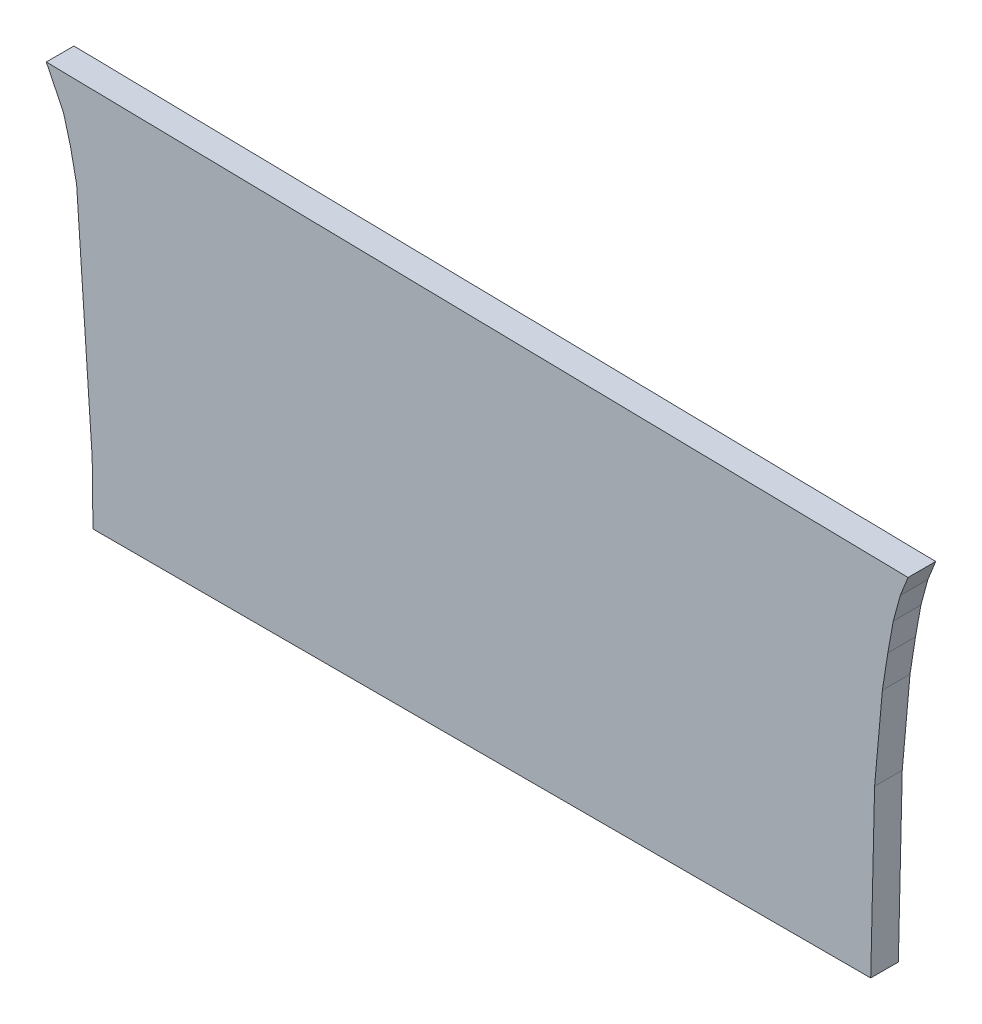
ISO-10303-21;
HEADER;
FILE_DESCRIPTION(('STEP AP214'),'2;1');
FILE_NAME('part.step','',(''),(''),'','','');
FILE_SCHEMA(('AUTOMOTIVE_DESIGN { 1 0 10303 214 1 1 1 1 }'));
ENDSEC;
DATA;
#1=APPLICATION_CONTEXT('core data for automotive mechanical design processes');
#2=APPLICATION_PROTOCOL_DEFINITION('international standard','automotive_design',2000,#1);
#3=PRODUCT_CONTEXT('',#1,'mechanical');
#4=PRODUCT('Part','Part','',(#3));
#5=PRODUCT_RELATED_PRODUCT_CATEGORY('part','',(#4));
#6=PRODUCT_DEFINITION_FORMATION('','',#4);
#7=PRODUCT_DEFINITION_CONTEXT('part definition',#1,'design');
#8=PRODUCT_DEFINITION('design','',#6,#7);
#9=PRODUCT_DEFINITION_SHAPE('','',#8);
#10=(LENGTH_UNIT() NAMED_UNIT(*) SI_UNIT(.MILLI.,.METRE.));
#11=(NAMED_UNIT(*) PLANE_ANGLE_UNIT() SI_UNIT($,.RADIAN.));
#12=(NAMED_UNIT(*) SI_UNIT($,.STERADIAN.) SOLID_ANGLE_UNIT());
#13=UNCERTAINTY_MEASURE_WITH_UNIT(LENGTH_MEASURE(1.E-05),#10,'distance_accuracy_value','');
#14=(GEOMETRIC_REPRESENTATION_CONTEXT(3) GLOBAL_UNCERTAINTY_ASSIGNED_CONTEXT((#13)) GLOBAL_UNIT_ASSIGNED_CONTEXT((#10,
#11,#12)) REPRESENTATION_CONTEXT('',''));
#15=CARTESIAN_POINT('',(0.,0.,0.));
#16=DIRECTION('',(0.,0.,1.));
#17=DIRECTION('',(1.,0.,0.));
#18=AXIS2_PLACEMENT_3D('',#15,#16,#17);
#19=CARTESIAN_POINT('',(57.939998626709,77.5899963378906,0.));
#20=DIRECTION('',(-0.999732083329301,0.0231465237575006,0.));
#21=DIRECTION('',(0.0231465237575006,0.999732083329301,0.));
#22=AXIS2_PLACEMENT_3D('',#19,#20,#21);
#23=PLANE('',#22);
#24=DIRECTION('',(0.0231465237575006,0.999732083329301,0.));
#25=VECTOR('',#24,1.);
#26=CARTESIAN_POINT('',(57.939998626709,77.5899963378906,0.03556));
#27=LINE('',#26,#25);
#28=CARTESIAN_POINT('',(57.939998626709,77.5899963378906,0.03556));
#29=VERTEX_POINT('',#28);
#30=CARTESIAN_POINT('',(57.9449996948242,77.8059997558594,0.03556));
#31=VERTEX_POINT('',#30);
#32=EDGE_CURVE('E11',#29,#31,#27,.T.);
#33=ORIENTED_EDGE('',*,*,#32,.F.);
#34=DIRECTION('',(0.,0.,1.));
#35=VECTOR('',#34,1.);
#36=CARTESIAN_POINT('',(57.939998626709,77.5899963378906,0.));
#37=LINE('',#36,#35);
#38=CARTESIAN_POINT('',(57.939998626709,77.5899963378906,0.));
#39=VERTEX_POINT('',#38);
#40=EDGE_CURVE('E24',#39,#29,#37,.T.);
#41=ORIENTED_EDGE('',*,*,#40,.F.);
#42=DIRECTION('',(0.0231465237575006,0.999732083329301,0.));
#43=VECTOR('',#42,1.);
#44=CARTESIAN_POINT('',(57.939998626709,77.5899963378906,0.));
#45=LINE('',#44,#43);
#46=CARTESIAN_POINT('',(57.9449996948242,77.8059997558594,0.));
#47=VERTEX_POINT('',#46);
#48=EDGE_CURVE('E130',#39,#47,#45,.T.);
#49=ORIENTED_EDGE('',*,*,#48,.T.);
#50=DIRECTION('',(0.,0.,1.));
#51=VECTOR('',#50,1.);
#52=CARTESIAN_POINT('',(57.9449996948242,77.8059997558594,0.));
#53=LINE('',#52,#51);
#54=EDGE_CURVE('E37',#47,#31,#53,.T.);
#55=ORIENTED_EDGE('',*,*,#54,.T.);
#56=EDGE_LOOP('',(#33,#41,#49,#55));
#57=FACE_BOUND('',#56,.T.);
#58=ADVANCED_FACE('F17',(#57),#23,.F.);
#59=CARTESIAN_POINT('',(57.9449996948242,77.8059997558594,0.));
#60=DIRECTION('',(-0.996035987954145,0.0889511703138886,0.));
#61=DIRECTION('',(0.0889511703138886,0.996035987954145,0.));
#62=AXIS2_PLACEMENT_3D('',#59,#60,#61);
#63=PLANE('',#62);
#64=DIRECTION('',(0.0889511703138886,0.996035987954145,0.));
#65=VECTOR('',#64,1.);
#66=CARTESIAN_POINT('',(57.9449996948242,77.8059997558594,0.03556));
#67=LINE('',#66,#65);
#68=CARTESIAN_POINT('',(57.9550018310547,77.9179992675781,0.03556));
#69=VERTEX_POINT('',#68);
#70=EDGE_CURVE('E210',#31,#69,#67,.T.);
#71=ORIENTED_EDGE('',*,*,#70,.F.);
#72=ORIENTED_EDGE('',*,*,#54,.F.);
#73=DIRECTION('',(0.0889511703138886,0.996035987954145,0.));
#74=VECTOR('',#73,1.);
#75=CARTESIAN_POINT('',(57.9449996948242,77.8059997558594,0.));
#76=LINE('',#75,#74);
#77=CARTESIAN_POINT('',(57.9550018310547,77.9179992675781,0.));
#78=VERTEX_POINT('',#77);
#79=EDGE_CURVE('E207',#47,#78,#76,.T.);
#80=ORIENTED_EDGE('',*,*,#79,.T.);
#81=DIRECTION('',(0.,0.,1.));
#82=VECTOR('',#81,1.);
#83=CARTESIAN_POINT('',(57.9550018310547,77.9179992675781,0.));
#84=LINE('',#83,#82);
#85=EDGE_CURVE('E205',#78,#69,#84,.T.);
#86=ORIENTED_EDGE('',*,*,#85,.T.);
#87=EDGE_LOOP('',(#71,#72,#80,#86));
#88=FACE_BOUND('',#87,.T.);
#89=ADVANCED_FACE('F218',(#88),#63,.F.);
#90=CARTESIAN_POINT('',(57.9550018310547,77.9179992675781,0.));
#91=DIRECTION('',(-0.988115620768596,0.15371245880895,0.));
#92=DIRECTION('',(0.15371245880895,0.988115620768596,0.));
#93=AXIS2_PLACEMENT_3D('',#90,#91,#92);
#94=PLANE('',#93);
#95=DIRECTION('',(0.15371245880895,0.988115620768595,0.));
#96=VECTOR('',#95,1.);
#97=CARTESIAN_POINT('',(57.9550018310547,77.9179992675781,0.03556));
#98=LINE('',#97,#96);
#99=CARTESIAN_POINT('',(57.9620018005371,77.9629974365234,0.03556));
#100=VERTEX_POINT('',#99);
#101=EDGE_CURVE('E202',#69,#100,#98,.T.);
#102=ORIENTED_EDGE('',*,*,#101,.F.);
#103=ORIENTED_EDGE('',*,*,#85,.F.);
#104=DIRECTION('',(0.15371245880895,0.988115620768595,0.));
#105=VECTOR('',#104,1.);
#106=CARTESIAN_POINT('',(57.9550018310547,77.9179992675781,0.));
#107=LINE('',#106,#105);
#108=CARTESIAN_POINT('',(57.9620018005371,77.9629974365234,0.));
#109=VERTEX_POINT('',#108);
#110=EDGE_CURVE('E199',#78,#109,#107,.T.);
#111=ORIENTED_EDGE('',*,*,#110,.T.);
#112=DIRECTION('',(0.,0.,1.));
#113=VECTOR('',#112,1.);
#114=CARTESIAN_POINT('',(57.9620018005371,77.9629974365234,0.));
#115=LINE('',#114,#113);
#116=EDGE_CURVE('E197',#109,#100,#115,.T.);
#117=ORIENTED_EDGE('',*,*,#116,.T.);
#118=EDGE_LOOP('',(#102,#103,#111,#117));
#119=FACE_BOUND('',#118,.T.);
#120=ADVANCED_FACE('F224',(#119),#94,.F.);
#121=CARTESIAN_POINT('',(57.9620018005371,77.9629974365234,0.));
#122=DIRECTION('',(-0.984272494666121,0.176656888469516,0.));
#123=DIRECTION('',(0.176656888469516,0.984272494666121,0.));
#124=AXIS2_PLACEMENT_3D('',#121,#122,#123);
#125=PLANE('',#124);
#126=DIRECTION('',(0.176656888469516,0.984272494666121,0.));
#127=VECTOR('',#126,1.);
#128=CARTESIAN_POINT('',(57.9620018005371,77.9629974365234,0.03556));
#129=LINE('',#128,#127);
#130=CARTESIAN_POINT('',(57.9690017700195,78.0019989013672,0.03556));
#131=VERTEX_POINT('',#130);
#132=EDGE_CURVE('E194',#100,#131,#129,.T.);
#133=ORIENTED_EDGE('',*,*,#132,.F.);
#134=ORIENTED_EDGE('',*,*,#116,.F.);
#135=DIRECTION('',(0.176656888469516,0.984272494666121,0.));
#136=VECTOR('',#135,1.);
#137=CARTESIAN_POINT('',(57.9620018005371,77.9629974365234,0.));
#138=LINE('',#137,#136);
#139=CARTESIAN_POINT('',(57.9690017700195,78.0019989013672,0.));
#140=VERTEX_POINT('',#139);
#141=EDGE_CURVE('E191',#109,#140,#138,.T.);
#142=ORIENTED_EDGE('',*,*,#141,.T.);
#143=DIRECTION('',(0.,0.,1.));
#144=VECTOR('',#143,1.);
#145=CARTESIAN_POINT('',(57.9690017700195,78.0019989013672,0.));
#146=LINE('',#145,#144);
#147=EDGE_CURVE('E189',#140,#131,#146,.T.);
#148=ORIENTED_EDGE('',*,*,#147,.T.);
#149=EDGE_LOOP('',(#133,#134,#142,#148));
#150=FACE_BOUND('',#149,.T.);
#151=ADVANCED_FACE('F226',(#150),#125,.F.);
#152=CARTESIAN_POINT('',(57.9690017700195,78.0019989013672,0.));
#153=DIRECTION('',(-0.964781832080558,0.26305135712876,0.));
#154=DIRECTION('',(0.26305135712876,0.964781832080558,0.));
#155=AXIS2_PLACEMENT_3D('',#152,#153,#154);
#156=PLANE('',#155);
#157=DIRECTION('',(0.26305135712876,0.964781832080558,0.));
#158=VECTOR('',#157,1.);
#159=CARTESIAN_POINT('',(57.9690017700195,78.0019989013672,0.03556));
#160=LINE('',#159,#158);
#161=CARTESIAN_POINT('',(57.9780006408691,78.0350036621094,0.03556));
#162=VERTEX_POINT('',#161);
#163=EDGE_CURVE('E186',#131,#162,#160,.T.);
#164=ORIENTED_EDGE('',*,*,#163,.F.);
#165=ORIENTED_EDGE('',*,*,#147,.F.);
#166=DIRECTION('',(0.26305135712876,0.964781832080558,0.));
#167=VECTOR('',#166,1.);
#168=CARTESIAN_POINT('',(57.9690017700195,78.0019989013672,0.));
#169=LINE('',#168,#167);
#170=CARTESIAN_POINT('',(57.9780006408691,78.0350036621094,0.));
#171=VERTEX_POINT('',#170);
#172=EDGE_CURVE('E183',#140,#171,#169,.T.);
#173=ORIENTED_EDGE('',*,*,#172,.T.);
#174=DIRECTION('',(0.,0.,1.));
#175=VECTOR('',#174,1.);
#176=CARTESIAN_POINT('',(57.9780006408691,78.0350036621094,0.));
#177=LINE('',#176,#175);
#178=EDGE_CURVE('E181',#171,#162,#177,.T.);
#179=ORIENTED_EDGE('',*,*,#178,.T.);
#180=EDGE_LOOP('',(#164,#165,#173,#179));
#181=FACE_BOUND('',#180,.T.);
#182=ADVANCED_FACE('F231',(#181),#156,.F.);
#183=CARTESIAN_POINT('',(57.9780006408691,78.0350036621094,0.));
#184=DIRECTION('',(-0.928466917639315,0.371415108536728,0.));
#185=DIRECTION('',(0.371415108536728,0.928466917639315,0.));
#186=AXIS2_PLACEMENT_3D('',#183,#184,#185);
#187=PLANE('',#186);
#188=DIRECTION('',(0.371415108536728,0.928466917639315,0.));
#189=VECTOR('',#188,1.);
#190=CARTESIAN_POINT('',(57.9780006408691,78.0350036621094,0.03556));
#191=LINE('',#190,#189);
#192=CARTESIAN_POINT('',(57.9879989624023,78.0599975585938,0.03556));
#193=VERTEX_POINT('',#192);
#194=EDGE_CURVE('E178',#162,#193,#191,.T.);
#195=ORIENTED_EDGE('',*,*,#194,.F.);
#196=ORIENTED_EDGE('',*,*,#178,.F.);
#197=DIRECTION('',(0.371415108536728,0.928466917639315,0.));
#198=VECTOR('',#197,1.);
#199=CARTESIAN_POINT('',(57.9780006408691,78.0350036621094,0.));
#200=LINE('',#199,#198);
#201=CARTESIAN_POINT('',(57.9879989624023,78.0599975585938,0.));
#202=VERTEX_POINT('',#201);
#203=EDGE_CURVE('E175',#171,#202,#200,.T.);
#204=ORIENTED_EDGE('',*,*,#203,.T.);
#205=DIRECTION('',(0.,0.,1.));
#206=VECTOR('',#205,1.);
#207=CARTESIAN_POINT('',(57.9879989624023,78.0599975585938,0.));
#208=LINE('',#207,#206);
#209=EDGE_CURVE('E173',#202,#193,#208,.T.);
#210=ORIENTED_EDGE('',*,*,#209,.T.);
#211=EDGE_LOOP('',(#195,#196,#204,#210));
#212=FACE_BOUND('',#211,.T.);
#213=ADVANCED_FACE('F234',(#212),#187,.F.);
#214=CARTESIAN_POINT('',(57.9879989624023,78.0599975585938,0.));
#215=DIRECTION('',(-0.0180514900249202,-0.999837058578987,0.));
#216=DIRECTION('',(-0.999837058578987,0.0180514900249202,0.));
#217=AXIS2_PLACEMENT_3D('',#214,#215,#216);
#218=PLANE('',#217);
#219=DIRECTION('',(-0.999837058578987,0.0180514900249202,0.));
#220=VECTOR('',#219,1.);
#221=CARTESIAN_POINT('',(57.9879989624023,78.0599975585938,0.03556));
#222=LINE('',#221,#220);
#223=CARTESIAN_POINT('',(56.8800010681152,78.0800018310547,0.03556));
#224=VERTEX_POINT('',#223);
#225=EDGE_CURVE('E170',#193,#224,#222,.T.);
#226=ORIENTED_EDGE('',*,*,#225,.F.);
#227=ORIENTED_EDGE('',*,*,#209,.F.);
#228=DIRECTION('',(-0.999837058578987,0.0180514900249202,0.));
#229=VECTOR('',#228,1.);
#230=CARTESIAN_POINT('',(57.9879989624023,78.0599975585938,0.));
#231=LINE('',#230,#229);
#232=CARTESIAN_POINT('',(56.8800010681152,78.0800018310547,0.));
#233=VERTEX_POINT('',#232);
#234=EDGE_CURVE('E167',#202,#233,#231,.T.);
#235=ORIENTED_EDGE('',*,*,#234,.T.);
#236=DIRECTION('',(0.,0.,1.));
#237=VECTOR('',#236,1.);
#238=CARTESIAN_POINT('',(56.8800010681152,78.0800018310547,0.));
#239=LINE('',#238,#237);
#240=EDGE_CURVE('E165',#233,#224,#239,.T.);
#241=ORIENTED_EDGE('',*,*,#240,.T.);
#242=EDGE_LOOP('',(#226,#227,#235,#241));
#243=FACE_BOUND('',#242,.T.);
#244=ADVANCED_FACE('F239',(#243),#218,.F.);
#245=CARTESIAN_POINT('',(56.8800010681152,78.0800018310547,0.));
#246=DIRECTION('',(0.898382357500373,0.439214229883405,0.));
#247=DIRECTION('',(0.439214229883405,-0.898382357500373,0.));
#248=AXIS2_PLACEMENT_3D('',#245,#246,#247);
#249=PLANE('',#248);
#250=DIRECTION('',(0.439214229883405,-0.898382357500373,0.));
#251=VECTOR('',#250,1.);
#252=CARTESIAN_POINT('',(56.8800010681152,78.0800018310547,0.03556));
#253=LINE('',#252,#251);
#254=CARTESIAN_POINT('',(56.9020004272461,78.0350036621094,0.03556));
#255=VERTEX_POINT('',#254);
#256=EDGE_CURVE('E162',#224,#255,#253,.T.);
#257=ORIENTED_EDGE('',*,*,#256,.F.);
#258=ORIENTED_EDGE('',*,*,#240,.F.);
#259=DIRECTION('',(0.439214229883405,-0.898382357500373,0.));
#260=VECTOR('',#259,1.);
#261=CARTESIAN_POINT('',(56.8800010681152,78.0800018310547,0.));
#262=LINE('',#261,#260);
#263=CARTESIAN_POINT('',(56.9020004272461,78.0350036621094,0.));
#264=VERTEX_POINT('',#263);
#265=EDGE_CURVE('E159',#233,#264,#262,.T.);
#266=ORIENTED_EDGE('',*,*,#265,.T.);
#267=DIRECTION('',(0.,0.,1.));
#268=VECTOR('',#267,1.);
#269=CARTESIAN_POINT('',(56.9020004272461,78.0350036621094,0.));
#270=LINE('',#269,#268);
#271=EDGE_CURVE('E157',#264,#255,#270,.T.);
#272=ORIENTED_EDGE('',*,*,#271,.T.);
#273=EDGE_LOOP('',(#257,#258,#266,#272));
#274=FACE_BOUND('',#273,.T.);
#275=ADVANCED_FACE('F242',(#274),#249,.F.);
#276=CARTESIAN_POINT('',(56.9020004272461,78.0350036621094,0.));
#277=DIRECTION('',(0.964781832080558,0.26305135712876,0.));
#278=DIRECTION('',(0.26305135712876,-0.964781832080558,0.));
#279=AXIS2_PLACEMENT_3D('',#276,#277,#278);
#280=PLANE('',#279);
#281=DIRECTION('',(0.26305135712876,-0.964781832080558,0.));
#282=VECTOR('',#281,1.);
#283=CARTESIAN_POINT('',(56.9020004272461,78.0350036621094,0.03556));
#284=LINE('',#283,#282);
#285=CARTESIAN_POINT('',(56.9109992980957,78.0019989013672,0.03556));
#286=VERTEX_POINT('',#285);
#287=EDGE_CURVE('E154',#255,#286,#284,.T.);
#288=ORIENTED_EDGE('',*,*,#287,.F.);
#289=ORIENTED_EDGE('',*,*,#271,.F.);
#290=DIRECTION('',(0.26305135712876,-0.964781832080558,0.));
#291=VECTOR('',#290,1.);
#292=CARTESIAN_POINT('',(56.9020004272461,78.0350036621094,0.));
#293=LINE('',#292,#291);
#294=CARTESIAN_POINT('',(56.9109992980957,78.0019989013672,0.));
#295=VERTEX_POINT('',#294);
#296=EDGE_CURVE('E151',#264,#295,#293,.T.);
#297=ORIENTED_EDGE('',*,*,#296,.T.);
#298=DIRECTION('',(0.,0.,1.));
#299=VECTOR('',#298,1.);
#300=CARTESIAN_POINT('',(56.9109992980957,78.0019989013672,0.));
#301=LINE('',#300,#299);
#302=EDGE_CURVE('E149',#295,#286,#301,.T.);
#303=ORIENTED_EDGE('',*,*,#302,.T.);
#304=EDGE_LOOP('',(#288,#289,#297,#303));
#305=FACE_BOUND('',#304,.T.);
#306=ADVANCED_FACE('F247',(#305),#280,.F.);
#307=CARTESIAN_POINT('',(56.9109992980957,78.0019989013672,0.));
#308=DIRECTION('',(0.979607052866723,0.200922925455939,0.));
#309=DIRECTION('',(0.200922925455939,-0.979607052866723,0.));
#310=AXIS2_PLACEMENT_3D('',#307,#308,#309);
#311=PLANE('',#310);
#312=DIRECTION('',(0.200922925455939,-0.979607052866723,0.));
#313=VECTOR('',#312,1.);
#314=CARTESIAN_POINT('',(56.9109992980957,78.0019989013672,0.03556));
#315=LINE('',#314,#313);
#316=CARTESIAN_POINT('',(56.9189987182617,77.9629974365234,0.03556));
#317=VERTEX_POINT('',#316);
#318=EDGE_CURVE('E146',#286,#317,#315,.T.);
#319=ORIENTED_EDGE('',*,*,#318,.F.);
#320=ORIENTED_EDGE('',*,*,#302,.F.);
#321=DIRECTION('',(0.200922925455939,-0.979607052866723,0.));
#322=VECTOR('',#321,1.);
#323=CARTESIAN_POINT('',(56.9109992980957,78.0019989013672,0.));
#324=LINE('',#323,#322);
#325=CARTESIAN_POINT('',(56.9189987182617,77.9629974365234,0.));
#326=VERTEX_POINT('',#325);
#327=EDGE_CURVE('E143',#295,#326,#324,.T.);
#328=ORIENTED_EDGE('',*,*,#327,.T.);
#329=DIRECTION('',(0.,0.,1.));
#330=VECTOR('',#329,1.);
#331=CARTESIAN_POINT('',(56.9189987182617,77.9629974365234,0.));
#332=LINE('',#331,#330);
#333=EDGE_CURVE('E141',#326,#317,#332,.T.);
#334=ORIENTED_EDGE('',*,*,#333,.T.);
#335=EDGE_LOOP('',(#319,#320,#328,#334));
#336=FACE_BOUND('',#335,.T.);
#337=ADVANCED_FACE('F250',(#336),#311,.F.);
#338=CARTESIAN_POINT('',(56.9189987182617,77.9629974365234,0.));
#339=DIRECTION('',(0.997694024075029,0.0678721911019252,0.));
#340=DIRECTION('',(0.0678721911019252,-0.997694024075029,0.));
#341=AXIS2_PLACEMENT_3D('',#338,#339,#340);
#342=PLANE('',#341);
#343=DIRECTION('',(0.0678721911019252,-0.997694024075029,0.));
#344=VECTOR('',#343,1.);
#345=CARTESIAN_POINT('',(56.9189987182617,77.9629974365234,0.03556));
#346=LINE('',#345,#344);
#347=CARTESIAN_POINT('',(56.9389991760254,77.6689987182617,0.03556));
#348=VERTEX_POINT('',#347);
#349=EDGE_CURVE('E138',#317,#348,#346,.T.);
#350=ORIENTED_EDGE('',*,*,#349,.F.);
#351=ORIENTED_EDGE('',*,*,#333,.F.);
#352=DIRECTION('',(0.0678721911019252,-0.997694024075029,0.));
#353=VECTOR('',#352,1.);
#354=CARTESIAN_POINT('',(56.9189987182617,77.9629974365234,0.));
#355=LINE('',#354,#353);
#356=CARTESIAN_POINT('',(56.9389991760254,77.6689987182617,0.));
#357=VERTEX_POINT('',#356);
#358=EDGE_CURVE('E136',#326,#357,#355,.T.);
#359=ORIENTED_EDGE('',*,*,#358,.T.);
#360=DIRECTION('',(0.,0.,1.));
#361=VECTOR('',#360,1.);
#362=CARTESIAN_POINT('',(56.9389991760254,77.6689987182617,0.));
#363=LINE('',#362,#361);
#364=EDGE_CURVE('E121',#357,#348,#363,.T.);
#365=ORIENTED_EDGE('',*,*,#364,.T.);
#366=EDGE_LOOP('',(#350,#351,#359,#365));
#367=FACE_BOUND('',#366,.T.);
#368=ADVANCED_FACE('F253',(#367),#342,.F.);
#369=CARTESIAN_POINT('',(56.9389991760254,77.6689987182617,0.));
#370=DIRECTION('',(0.999919987053636,0.0126498810530204,0.));
#371=DIRECTION('',(0.0126498810530204,-0.999919987053636,0.));
#372=AXIS2_PLACEMENT_3D('',#369,#370,#371);
#373=PLANE('',#372);
#374=DIRECTION('',(0.0126498810530204,-0.999919987053636,0.));
#375=VECTOR('',#374,1.);
#376=CARTESIAN_POINT('',(56.9389991760254,77.6689987182617,0.03556));
#377=LINE('',#376,#375);
#378=CARTESIAN_POINT('',(56.939998626709,77.5899963378906,0.03556));
#379=VERTEX_POINT('',#378);
#380=EDGE_CURVE('E125',#348,#379,#377,.T.);
#381=ORIENTED_EDGE('',*,*,#380,.F.);
#382=ORIENTED_EDGE('',*,*,#364,.F.);
#383=DIRECTION('',(0.0126498810530204,-0.999919987053636,0.));
#384=VECTOR('',#383,1.);
#385=CARTESIAN_POINT('',(56.9389991760254,77.6689987182617,0.));
#386=LINE('',#385,#384);
#387=CARTESIAN_POINT('',(56.939998626709,77.5899963378906,0.));
#388=VERTEX_POINT('',#387);
#389=EDGE_CURVE('E117',#357,#388,#386,.T.);
#390=ORIENTED_EDGE('',*,*,#389,.T.);
#391=DIRECTION('',(0.,0.,1.));
#392=VECTOR('',#391,1.);
#393=CARTESIAN_POINT('',(56.939998626709,77.5899963378906,0.));
#394=LINE('',#393,#392);
#395=EDGE_CURVE('E107',#388,#379,#394,.T.);
#396=ORIENTED_EDGE('',*,*,#395,.T.);
#397=EDGE_LOOP('',(#381,#382,#390,#396));
#398=FACE_BOUND('',#397,.T.);
#399=ADVANCED_FACE('F120',(#398),#373,.F.);
#400=CARTESIAN_POINT('',(56.939998626709,77.5899963378906,0.));
#401=DIRECTION('',(0.,1.,0.));
#402=DIRECTION('',(1.,0.,0.));
#403=AXIS2_PLACEMENT_3D('',#400,#401,#402);
#404=PLANE('',#403);
#405=DIRECTION('',(1.,0.,0.));
#406=VECTOR('',#405,1.);
#407=CARTESIAN_POINT('',(56.939998626709,77.5899963378906,0.03556));
#408=LINE('',#407,#406);
#409=EDGE_CURVE('E113',#379,#29,#408,.T.);
#410=ORIENTED_EDGE('',*,*,#409,.F.);
#411=ORIENTED_EDGE('',*,*,#395,.F.);
#412=DIRECTION('',(1.,0.,0.));
#413=VECTOR('',#412,1.);
#414=CARTESIAN_POINT('',(56.939998626709,77.5899963378906,0.));
#415=LINE('',#414,#413);
#416=EDGE_CURVE('E111',#388,#39,#415,.T.);
#417=ORIENTED_EDGE('',*,*,#416,.T.);
#418=ORIENTED_EDGE('',*,*,#40,.T.);
#419=EDGE_LOOP('',(#410,#411,#417,#418));
#420=FACE_BOUND('',#419,.T.);
#421=ADVANCED_FACE('F109',(#420),#404,.F.);
#422=CARTESIAN_POINT('',(57.939998626709,77.5899963378906,0.));
#423=DIRECTION('',(0.,0.,1.));
#424=DIRECTION('',(1.,0.,0.));
#425=AXIS2_PLACEMENT_3D('',#422,#423,#424);
#426=PLANE('',#425);
#427=ORIENTED_EDGE('',*,*,#416,.F.);
#428=ORIENTED_EDGE('',*,*,#389,.F.);
#429=ORIENTED_EDGE('',*,*,#358,.F.);
#430=ORIENTED_EDGE('',*,*,#327,.F.);
#431=ORIENTED_EDGE('',*,*,#296,.F.);
#432=ORIENTED_EDGE('',*,*,#265,.F.);
#433=ORIENTED_EDGE('',*,*,#234,.F.);
#434=ORIENTED_EDGE('',*,*,#203,.F.);
#435=ORIENTED_EDGE('',*,*,#172,.F.);
#436=ORIENTED_EDGE('',*,*,#141,.F.);
#437=ORIENTED_EDGE('',*,*,#110,.F.);
#438=ORIENTED_EDGE('',*,*,#79,.F.);
#439=ORIENTED_EDGE('',*,*,#48,.F.);
#440=EDGE_LOOP('',(#427,#428,#429,#430,#431,#432,#433,#434,#435,#436,#437,#438,#439));
#441=FACE_BOUND('',#440,.T.);
#442=ADVANCED_FACE('F128',(#441),#426,.F.);
#443=CARTESIAN_POINT('',(57.939998626709,77.5899963378906,0.03556));
#444=DIRECTION('',(0.,0.,1.));
#445=DIRECTION('',(1.,0.,0.));
#446=AXIS2_PLACEMENT_3D('',#443,#444,#445);
#447=PLANE('',#446);
#448=ORIENTED_EDGE('',*,*,#32,.T.);
#449=ORIENTED_EDGE('',*,*,#70,.T.);
#450=ORIENTED_EDGE('',*,*,#101,.T.);
#451=ORIENTED_EDGE('',*,*,#132,.T.);
#452=ORIENTED_EDGE('',*,*,#163,.T.);
#453=ORIENTED_EDGE('',*,*,#194,.T.);
#454=ORIENTED_EDGE('',*,*,#225,.T.);
#455=ORIENTED_EDGE('',*,*,#256,.T.);
#456=ORIENTED_EDGE('',*,*,#287,.T.);
#457=ORIENTED_EDGE('',*,*,#318,.T.);
#458=ORIENTED_EDGE('',*,*,#349,.T.);
#459=ORIENTED_EDGE('',*,*,#380,.T.);
#460=ORIENTED_EDGE('',*,*,#409,.T.);
#461=EDGE_LOOP('',(#448,#449,#450,#451,#452,#453,#454,#455,#456,#457,#458,#459,#460));
#462=FACE_BOUND('',#461,.T.);
#463=ADVANCED_FACE('F221',(#462),#447,.T.);
#464=CLOSED_SHELL('',(#58,#89,#120,#151,#182,#213,#244,#275,#306,#337,#368,#399,#421,#442,#463));
#465=MANIFOLD_SOLID_BREP('B1',#464);
#466=ADVANCED_BREP_SHAPE_REPRESENTATION('',(#18,#465),#14);
#467=SHAPE_DEFINITION_REPRESENTATION(#9,#466);
ENDSEC;
END-ISO-10303-21;
